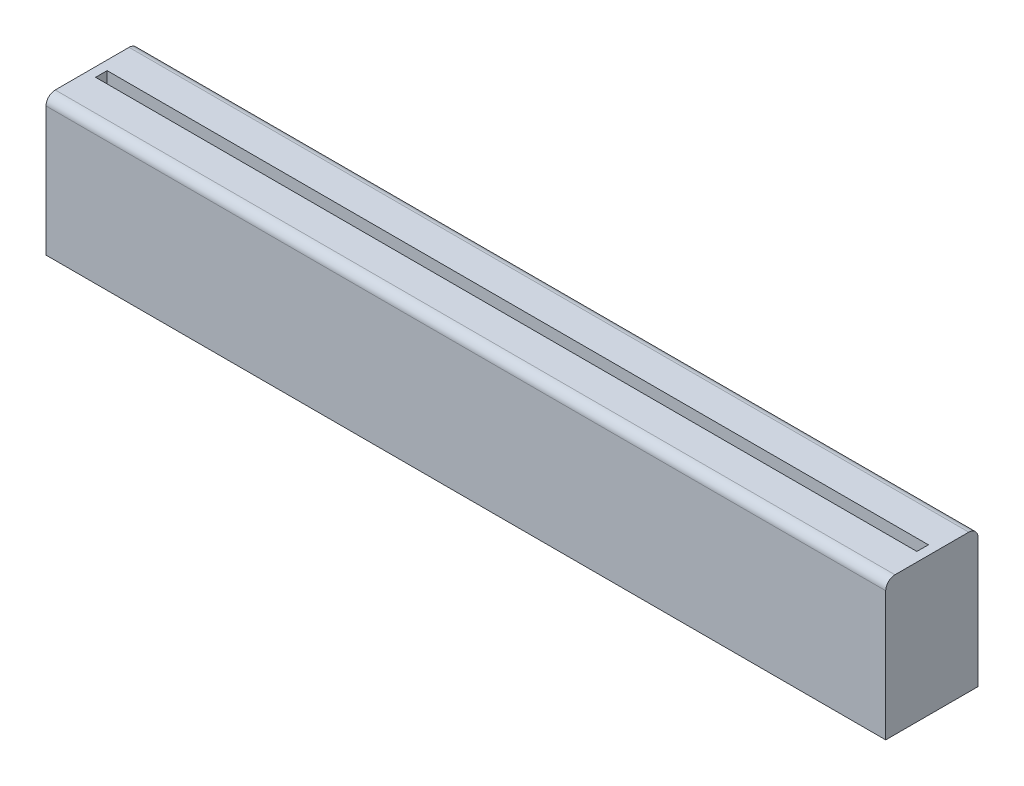
ISO-10303-21;
HEADER;
FILE_DESCRIPTION(('STEP AP214'),'2;1');
FILE_NAME('part.step','',(''),(''),'','','');
FILE_SCHEMA(('AUTOMOTIVE_DESIGN { 1 0 10303 214 1 1 1 1 }'));
ENDSEC;
DATA;
#1=APPLICATION_CONTEXT('core data for automotive mechanical design processes');
#2=APPLICATION_PROTOCOL_DEFINITION('international standard','automotive_design',2000,#1);
#3=PRODUCT_CONTEXT('',#1,'mechanical');
#4=PRODUCT('Part','Part','',(#3));
#5=PRODUCT_RELATED_PRODUCT_CATEGORY('part','',(#4));
#6=PRODUCT_DEFINITION_FORMATION('','',#4);
#7=PRODUCT_DEFINITION_CONTEXT('part definition',#1,'design');
#8=PRODUCT_DEFINITION('design','',#6,#7);
#9=PRODUCT_DEFINITION_SHAPE('','',#8);
#10=(LENGTH_UNIT() NAMED_UNIT(*) SI_UNIT(.MILLI.,.METRE.));
#11=(NAMED_UNIT(*) PLANE_ANGLE_UNIT() SI_UNIT($,.RADIAN.));
#12=(NAMED_UNIT(*) SI_UNIT($,.STERADIAN.) SOLID_ANGLE_UNIT());
#13=UNCERTAINTY_MEASURE_WITH_UNIT(LENGTH_MEASURE(1.E-05),#10,'distance_accuracy_value','');
#14=(GEOMETRIC_REPRESENTATION_CONTEXT(3) GLOBAL_UNCERTAINTY_ASSIGNED_CONTEXT((#13)) GLOBAL_UNIT_ASSIGNED_CONTEXT((#10,
#11,#12)) REPRESENTATION_CONTEXT('',''));
#15=CARTESIAN_POINT('',(0.,0.,0.));
#16=DIRECTION('',(0.,0.,1.));
#17=DIRECTION('',(1.,0.,0.));
#18=AXIS2_PLACEMENT_3D('',#15,#16,#17);
#19=CARTESIAN_POINT('',(114.3,0.,-1.5875));
#20=DIRECTION('',(0.,0.,-1.));
#21=DIRECTION('',(0.,1.,0.));
#22=AXIS2_PLACEMENT_3D('',#19,#20,#21);
#23=PLANE('',#22);
#24=DIRECTION('',(0.,1.,0.));
#25=VECTOR('',#24,1.);
#26=CARTESIAN_POINT('',(-113.03,0.,-1.5875));
#27=LINE('',#26,#25);
#28=CARTESIAN_POINT('',(-113.03,7.62,-1.5875));
#29=VERTEX_POINT('',#28);
#30=CARTESIAN_POINT('',(-113.03,38.1,-1.5875));
#31=VERTEX_POINT('',#30);
#32=EDGE_CURVE('E311',#29,#31,#27,.T.);
#33=ORIENTED_EDGE('',*,*,#32,.F.);
#34=DIRECTION('',(-1.,0.,0.));
#35=VECTOR('',#34,1.);
#36=CARTESIAN_POINT('',(114.3,7.62,-1.5875));
#37=LINE('',#36,#35);
#38=CARTESIAN_POINT('',(113.03,7.62,-1.5875));
#39=VERTEX_POINT('',#38);
#40=EDGE_CURVE('E434',#39,#29,#37,.T.);
#41=ORIENTED_EDGE('',*,*,#40,.F.);
#42=DIRECTION('',(0.,-1.,0.));
#43=VECTOR('',#42,1.);
#44=CARTESIAN_POINT('',(113.03,0.,-1.5875));
#45=LINE('',#44,#43);
#46=CARTESIAN_POINT('',(113.03,38.1,-1.5875));
#47=VERTEX_POINT('',#46);
#48=EDGE_CURVE('E380',#47,#39,#45,.T.);
#49=ORIENTED_EDGE('',*,*,#48,.F.);
#50=DIRECTION('',(-1.,0.,0.));
#51=VECTOR('',#50,1.);
#52=CARTESIAN_POINT('',(114.3,38.1,-1.5875));
#53=LINE('',#52,#51);
#54=EDGE_CURVE('E437',#47,#31,#53,.T.);
#55=ORIENTED_EDGE('',*,*,#54,.T.);
#56=EDGE_LOOP('',(#33,#41,#49,#55));
#57=FACE_BOUND('',#56,.T.);
#58=ADVANCED_FACE('F46',(#57),#23,.F.);
#59=CARTESIAN_POINT('',(114.3,0.,1.5875));
#60=DIRECTION('',(0.,0.,-1.));
#61=DIRECTION('',(0.,1.,0.));
#62=AXIS2_PLACEMENT_3D('',#59,#60,#61);
#63=PLANE('',#62);
#64=DIRECTION('',(-1.,0.,0.));
#65=VECTOR('',#64,1.);
#66=CARTESIAN_POINT('',(114.3,7.62,1.5875));
#67=LINE('',#66,#65);
#68=CARTESIAN_POINT('',(113.03,7.62,1.5875));
#69=VERTEX_POINT('',#68);
#70=CARTESIAN_POINT('',(-113.03,7.62,1.5875));
#71=VERTEX_POINT('',#70);
#72=EDGE_CURVE('E427',#69,#71,#67,.T.);
#73=ORIENTED_EDGE('',*,*,#72,.T.);
#74=DIRECTION('',(0.,1.,0.));
#75=VECTOR('',#74,1.);
#76=CARTESIAN_POINT('',(-113.03,0.,1.5875));
#77=LINE('',#76,#75);
#78=CARTESIAN_POINT('',(-113.03,38.1,1.5875));
#79=VERTEX_POINT('',#78);
#80=EDGE_CURVE('E308',#71,#79,#77,.T.);
#81=ORIENTED_EDGE('',*,*,#80,.T.);
#82=DIRECTION('',(-1.,0.,0.));
#83=VECTOR('',#82,1.);
#84=CARTESIAN_POINT('',(114.3,38.1,1.5875));
#85=LINE('',#84,#83);
#86=CARTESIAN_POINT('',(113.03,38.1,1.5875));
#87=VERTEX_POINT('',#86);
#88=EDGE_CURVE('E424',#87,#79,#85,.T.);
#89=ORIENTED_EDGE('',*,*,#88,.F.);
#90=DIRECTION('',(0.,-1.,0.));
#91=VECTOR('',#90,1.);
#92=CARTESIAN_POINT('',(113.03,0.,1.5875));
#93=LINE('',#92,#91);
#94=EDGE_CURVE('E366',#87,#69,#93,.T.);
#95=ORIENTED_EDGE('',*,*,#94,.T.);
#96=EDGE_LOOP('',(#73,#81,#89,#95));
#97=FACE_BOUND('',#96,.T.);
#98=ADVANCED_FACE('F474',(#97),#63,.T.);
#99=CARTESIAN_POINT('',(114.3,0.,-6.35));
#100=DIRECTION('',(0.,0.,-1.));
#101=DIRECTION('',(0.,1.,0.));
#102=AXIS2_PLACEMENT_3D('',#99,#100,#101);
#103=PLANE('',#102);
#104=DIRECTION('',(0.,-1.,0.));
#105=VECTOR('',#104,1.);
#106=CARTESIAN_POINT('',(-115.57,7.62,-6.35));
#107=LINE('',#106,#105);
#108=CARTESIAN_POINT('',(-115.57,7.62,-6.35));
#109=VERTEX_POINT('',#108);
#110=CARTESIAN_POINT('',(-115.57,2.54,-6.35));
#111=VERTEX_POINT('',#110);
#112=EDGE_CURVE('E238',#109,#111,#107,.T.);
#113=ORIENTED_EDGE('',*,*,#112,.T.);
#114=DIRECTION('',(-1.,0.,0.));
#115=VECTOR('',#114,1.);
#116=CARTESIAN_POINT('',(114.3,2.54,-6.35));
#117=LINE('',#116,#115);
#118=CARTESIAN_POINT('',(113.03,2.54,-6.35));
#119=VERTEX_POINT('',#118);
#120=EDGE_CURVE('E224',#119,#111,#117,.T.);
#121=ORIENTED_EDGE('',*,*,#120,.F.);
#122=DIRECTION('',(0.,-1.,0.));
#123=VECTOR('',#122,1.);
#124=CARTESIAN_POINT('',(113.03,0.,-6.35));
#125=LINE('',#124,#123);
#126=CARTESIAN_POINT('',(113.03,7.62,-6.35));
#127=VERTEX_POINT('',#126);
#128=EDGE_CURVE('E376',#127,#119,#125,.T.);
#129=ORIENTED_EDGE('',*,*,#128,.F.);
#130=DIRECTION('',(-1.,0.,0.));
#131=VECTOR('',#130,1.);
#132=CARTESIAN_POINT('',(114.3,7.62,-6.35));
#133=LINE('',#132,#131);
#134=EDGE_CURVE('E234',#127,#109,#133,.T.);
#135=ORIENTED_EDGE('',*,*,#134,.T.);
#136=EDGE_LOOP('',(#113,#121,#129,#135));
#137=FACE_BOUND('',#136,.T.);
#138=ADVANCED_FACE('F239',(#137),#103,.F.);
#139=CARTESIAN_POINT('',(114.3,2.54,0.));
#140=DIRECTION('',(0.,1.,0.));
#141=DIRECTION('',(0.,0.,1.));
#142=AXIS2_PLACEMENT_3D('',#139,#140,#141);
#143=PLANE('',#142);
#144=DIRECTION('',(0.,0.,1.));
#145=VECTOR('',#144,1.);
#146=CARTESIAN_POINT('',(-115.57,2.54,-6.35));
#147=LINE('',#146,#145);
#148=CARTESIAN_POINT('',(-115.57,2.54,6.35));
#149=VERTEX_POINT('',#148);
#150=EDGE_CURVE('E229',#111,#149,#147,.T.);
#151=ORIENTED_EDGE('',*,*,#150,.T.);
#152=DIRECTION('',(-1.,0.,0.));
#153=VECTOR('',#152,1.);
#154=CARTESIAN_POINT('',(114.3,2.54,6.35));
#155=LINE('',#154,#153);
#156=CARTESIAN_POINT('',(113.03,2.54,6.35));
#157=VERTEX_POINT('',#156);
#158=EDGE_CURVE('E235',#157,#149,#155,.T.);
#159=ORIENTED_EDGE('',*,*,#158,.F.);
#160=DIRECTION('',(0.,0.,-1.));
#161=VECTOR('',#160,1.);
#162=CARTESIAN_POINT('',(113.03,2.54,0.));
#163=LINE('',#162,#161);
#164=EDGE_CURVE('E231',#157,#119,#163,.T.);
#165=ORIENTED_EDGE('',*,*,#164,.T.);
#166=ORIENTED_EDGE('',*,*,#120,.T.);
#167=EDGE_LOOP('',(#151,#159,#165,#166));
#168=FACE_BOUND('',#167,.T.);
#169=ADVANCED_FACE('F226',(#168),#143,.T.);
#170=CARTESIAN_POINT('',(114.3,0.,6.35));
#171=DIRECTION('',(0.,0.,-1.));
#172=DIRECTION('',(-1.,0.,0.));
#173=AXIS2_PLACEMENT_3D('',#170,#171,#172);
#174=PLANE('',#173);
#175=DIRECTION('',(0.,1.,0.));
#176=VECTOR('',#175,1.);
#177=CARTESIAN_POINT('',(-115.57,7.62,6.35));
#178=LINE('',#177,#176);
#179=CARTESIAN_POINT('',(-115.57,7.62,6.35));
#180=VERTEX_POINT('',#179);
#181=EDGE_CURVE('E248',#149,#180,#178,.T.);
#182=ORIENTED_EDGE('',*,*,#181,.T.);
#183=DIRECTION('',(-1.,0.,0.));
#184=VECTOR('',#183,1.);
#185=CARTESIAN_POINT('',(114.3,7.62,6.35));
#186=LINE('',#185,#184);
#187=CARTESIAN_POINT('',(113.03,7.62,6.35));
#188=VERTEX_POINT('',#187);
#189=EDGE_CURVE('E430',#188,#180,#186,.T.);
#190=ORIENTED_EDGE('',*,*,#189,.F.);
#191=DIRECTION('',(0.,-1.,0.));
#192=VECTOR('',#191,1.);
#193=CARTESIAN_POINT('',(113.03,0.,6.35));
#194=LINE('',#193,#192);
#195=EDGE_CURVE('E372',#188,#157,#194,.T.);
#196=ORIENTED_EDGE('',*,*,#195,.T.);
#197=ORIENTED_EDGE('',*,*,#158,.T.);
#198=EDGE_LOOP('',(#182,#190,#196,#197));
#199=FACE_BOUND('',#198,.T.);
#200=ADVANCED_FACE('F488',(#199),#174,.T.);
#201=CARTESIAN_POINT('',(114.3,7.62,0.));
#202=DIRECTION('',(0.,-1.,0.));
#203=DIRECTION('',(0.,0.,-1.));
#204=AXIS2_PLACEMENT_3D('',#201,#202,#203);
#205=PLANE('',#204);
#206=DIRECTION('',(0.,0.,-1.));
#207=VECTOR('',#206,1.);
#208=CARTESIAN_POINT('',(-113.03,7.62,-6.35));
#209=LINE('',#208,#207);
#210=EDGE_CURVE('E244',#71,#29,#209,.T.);
#211=ORIENTED_EDGE('',*,*,#210,.F.);
#212=ORIENTED_EDGE('',*,*,#72,.F.);
#213=DIRECTION('',(0.,0.,1.));
#214=VECTOR('',#213,1.);
#215=CARTESIAN_POINT('',(113.03,7.62,0.));
#216=LINE('',#215,#214);
#217=EDGE_CURVE('E369',#69,#188,#216,.T.);
#218=ORIENTED_EDGE('',*,*,#217,.T.);
#219=ORIENTED_EDGE('',*,*,#189,.T.);
#220=DIRECTION('',(0.,0.,-1.));
#221=VECTOR('',#220,1.);
#222=CARTESIAN_POINT('',(-115.57,7.62,-6.35));
#223=LINE('',#222,#221);
#224=EDGE_CURVE('E250',#180,#109,#223,.T.);
#225=ORIENTED_EDGE('',*,*,#224,.T.);
#226=ORIENTED_EDGE('',*,*,#134,.F.);
#227=DIRECTION('',(0.,0.,-1.));
#228=VECTOR('',#227,1.);
#229=CARTESIAN_POINT('',(113.03,7.62,0.));
#230=LINE('',#229,#228);
#231=EDGE_CURVE('E378',#39,#127,#230,.T.);
#232=ORIENTED_EDGE('',*,*,#231,.F.);
#233=ORIENTED_EDGE('',*,*,#40,.T.);
#234=EDGE_LOOP('',(#211,#212,#218,#219,#225,#226,#232,#233));
#235=FACE_BOUND('',#234,.T.);
#236=ADVANCED_FACE('F491',(#235),#205,.T.);
#237=CARTESIAN_POINT('',(114.3,35.56,-10.16));
#238=DIRECTION('',(-1.,0.,0.));
#239=DIRECTION('',(0.,0.,1.));
#240=AXIS2_PLACEMENT_3D('',#237,#238,#239);
#241=CYLINDRICAL_SURFACE('',#240,2.54);
#242=CARTESIAN_POINT('',(-115.57,35.56,-10.16));
#243=DIRECTION('',(-1.,0.,0.));
#244=DIRECTION('',(0.,0.,1.));
#245=AXIS2_PLACEMENT_3D('',#242,#243,#244);
#246=CIRCLE('',#245,2.54);
#247=CARTESIAN_POINT('',(-115.57,38.1,-10.16));
#248=VERTEX_POINT('',#247);
#249=CARTESIAN_POINT('',(-115.57,35.56,-12.7));
#250=VERTEX_POINT('',#249);
#251=EDGE_CURVE('E271',#248,#250,#246,.T.);
#252=ORIENTED_EDGE('',*,*,#251,.F.);
#253=DIRECTION('',(-1.,0.,0.));
#254=VECTOR('',#253,1.);
#255=CARTESIAN_POINT('',(114.3,38.1,-10.16));
#256=LINE('',#255,#254);
#257=CARTESIAN_POINT('',(115.57,38.1,-10.16));
#258=VERTEX_POINT('',#257);
#259=EDGE_CURVE('E401',#258,#248,#256,.T.);
#260=ORIENTED_EDGE('',*,*,#259,.F.);
#261=CARTESIAN_POINT('',(115.57,35.56,-10.16));
#262=DIRECTION('',(1.,0.,0.));
#263=DIRECTION('',(0.,0.,-1.));
#264=AXIS2_PLACEMENT_3D('',#261,#262,#263);
#265=CIRCLE('',#264,2.54);
#266=CARTESIAN_POINT('',(115.57,35.56,-12.7));
#267=VERTEX_POINT('',#266);
#268=EDGE_CURVE('E326',#267,#258,#265,.T.);
#269=ORIENTED_EDGE('',*,*,#268,.F.);
#270=DIRECTION('',(-1.,0.,0.));
#271=VECTOR('',#270,1.);
#272=CARTESIAN_POINT('',(114.3,35.56,-12.7));
#273=LINE('',#272,#271);
#274=EDGE_CURVE('E382',#267,#250,#273,.T.);
#275=ORIENTED_EDGE('',*,*,#274,.T.);
#276=EDGE_LOOP('',(#252,#260,#269,#275));
#277=FACE_BOUND('',#276,.T.);
#278=ADVANCED_FACE('F48',(#277),#241,.T.);
#279=CARTESIAN_POINT('',(114.3,38.1,0.));
#280=DIRECTION('',(0.,1.,0.));
#281=DIRECTION('',(0.,0.,1.));
#282=AXIS2_PLACEMENT_3D('',#279,#280,#281);
#283=PLANE('',#282);
#284=DIRECTION('',(0.,0.,-1.));
#285=VECTOR('',#284,1.);
#286=CARTESIAN_POINT('',(-113.03,38.1,10.16));
#287=LINE('',#286,#285);
#288=EDGE_CURVE('E254',#79,#31,#287,.T.);
#289=ORIENTED_EDGE('',*,*,#288,.T.);
#290=ORIENTED_EDGE('',*,*,#54,.F.);
#291=DIRECTION('',(0.,0.,-1.));
#292=VECTOR('',#291,1.);
#293=CARTESIAN_POINT('',(113.03,38.1,0.));
#294=LINE('',#293,#292);
#295=EDGE_CURVE('E313',#87,#47,#294,.T.);
#296=ORIENTED_EDGE('',*,*,#295,.F.);
#297=ORIENTED_EDGE('',*,*,#88,.T.);
#298=EDGE_LOOP('',(#289,#290,#296,#297));
#299=FACE_BOUND('',#298,.T.);
#300=DIRECTION('',(0.,0.,-1.));
#301=VECTOR('',#300,1.);
#302=CARTESIAN_POINT('',(-115.57,38.1,10.16));
#303=LINE('',#302,#301);
#304=CARTESIAN_POINT('',(-115.57,38.1,10.16));
#305=VERTEX_POINT('',#304);
#306=EDGE_CURVE('E268',#305,#248,#303,.T.);
#307=ORIENTED_EDGE('',*,*,#306,.F.);
#308=DIRECTION('',(-1.,0.,0.));
#309=VECTOR('',#308,1.);
#310=CARTESIAN_POINT('',(114.3,38.1,10.16));
#311=LINE('',#310,#309);
#312=CARTESIAN_POINT('',(115.57,38.1,10.16));
#313=VERTEX_POINT('',#312);
#314=EDGE_CURVE('E422',#313,#305,#311,.T.);
#315=ORIENTED_EDGE('',*,*,#314,.F.);
#316=DIRECTION('',(0.,0.,-1.));
#317=VECTOR('',#316,1.);
#318=CARTESIAN_POINT('',(115.57,38.1,0.));
#319=LINE('',#318,#317);
#320=EDGE_CURVE('E329',#313,#258,#319,.T.);
#321=ORIENTED_EDGE('',*,*,#320,.T.);
#322=ORIENTED_EDGE('',*,*,#259,.T.);
#323=EDGE_LOOP('',(#307,#315,#321,#322));
#324=FACE_BOUND('',#323,.T.);
#325=ADVANCED_FACE('F441',(#299,#324),#283,.T.);
#326=CARTESIAN_POINT('',(114.3,35.56,10.16));
#327=DIRECTION('',(-1.,0.,0.));
#328=DIRECTION('',(0.,0.,1.));
#329=AXIS2_PLACEMENT_3D('',#326,#327,#328);
#330=CYLINDRICAL_SURFACE('',#329,2.54);
#331=CARTESIAN_POINT('',(-115.57,35.56,10.16));
#332=DIRECTION('',(-1.,0.,0.));
#333=DIRECTION('',(0.,0.,1.));
#334=AXIS2_PLACEMENT_3D('',#331,#332,#333);
#335=CIRCLE('',#334,2.54);
#336=CARTESIAN_POINT('',(-115.57,35.56,12.7));
#337=VERTEX_POINT('',#336);
#338=EDGE_CURVE('E265',#337,#305,#335,.T.);
#339=ORIENTED_EDGE('',*,*,#338,.F.);
#340=DIRECTION('',(-1.,0.,0.));
#341=VECTOR('',#340,1.);
#342=CARTESIAN_POINT('',(114.3,35.56,12.7));
#343=LINE('',#342,#341);
#344=CARTESIAN_POINT('',(115.57,35.56,12.7));
#345=VERTEX_POINT('',#344);
#346=EDGE_CURVE('E420',#345,#337,#343,.T.);
#347=ORIENTED_EDGE('',*,*,#346,.F.);
#348=CARTESIAN_POINT('',(115.57,35.56,10.16));
#349=DIRECTION('',(1.,0.,0.));
#350=DIRECTION('',(0.,0.,-1.));
#351=AXIS2_PLACEMENT_3D('',#348,#349,#350);
#352=CIRCLE('',#351,2.54);
#353=EDGE_CURVE('E314',#313,#345,#352,.T.);
#354=ORIENTED_EDGE('',*,*,#353,.F.);
#355=ORIENTED_EDGE('',*,*,#314,.T.);
#356=EDGE_LOOP('',(#339,#347,#354,#355));
#357=FACE_BOUND('',#356,.T.);
#358=ADVANCED_FACE('F460',(#357),#330,.T.);
#359=CARTESIAN_POINT('',(114.3,0.,12.7));
#360=DIRECTION('',(0.,0.,1.));
#361=DIRECTION('',(1.,0.,0.));
#362=AXIS2_PLACEMENT_3D('',#359,#360,#361);
#363=PLANE('',#362);
#364=DIRECTION('',(0.,1.,0.));
#365=VECTOR('',#364,1.);
#366=CARTESIAN_POINT('',(-115.57,0.,12.7));
#367=LINE('',#366,#365);
#368=CARTESIAN_POINT('',(-115.57,0.,12.7));
#369=VERTEX_POINT('',#368);
#370=EDGE_CURVE('E262',#369,#337,#367,.T.);
#371=ORIENTED_EDGE('',*,*,#370,.F.);
#372=DIRECTION('',(-1.,0.,0.));
#373=VECTOR('',#372,1.);
#374=CARTESIAN_POINT('',(114.3,0.,12.7));
#375=LINE('',#374,#373);
#376=CARTESIAN_POINT('',(115.57,0.,12.7));
#377=VERTEX_POINT('',#376);
#378=EDGE_CURVE('E418',#377,#369,#375,.T.);
#379=ORIENTED_EDGE('',*,*,#378,.F.);
#380=DIRECTION('',(0.,1.,0.));
#381=VECTOR('',#380,1.);
#382=CARTESIAN_POINT('',(115.57,0.,12.7));
#383=LINE('',#382,#381);
#384=EDGE_CURVE('E317',#377,#345,#383,.T.);
#385=ORIENTED_EDGE('',*,*,#384,.T.);
#386=ORIENTED_EDGE('',*,*,#346,.T.);
#387=EDGE_LOOP('',(#371,#379,#385,#386));
#388=FACE_BOUND('',#387,.T.);
#389=ADVANCED_FACE('F456',(#388),#363,.T.);
#390=CARTESIAN_POINT('',(114.3,0.,0.));
#391=DIRECTION('',(0.,-1.,0.));
#392=DIRECTION('',(0.,0.,-1.));
#393=AXIS2_PLACEMENT_3D('',#390,#391,#392);
#394=PLANE('',#393);
#395=DIRECTION('',(0.,0.,1.));
#396=VECTOR('',#395,1.);
#397=CARTESIAN_POINT('',(-115.57,0.,-12.7));
#398=LINE('',#397,#396);
#399=CARTESIAN_POINT('',(-115.57,0.,-12.7));
#400=VERTEX_POINT('',#399);
#401=EDGE_CURVE('E259',#400,#369,#398,.T.);
#402=ORIENTED_EDGE('',*,*,#401,.F.);
#403=DIRECTION('',(-1.,0.,0.));
#404=VECTOR('',#403,1.);
#405=CARTESIAN_POINT('',(114.3,0.,-12.7));
#406=LINE('',#405,#404);
#407=CARTESIAN_POINT('',(115.57,0.,-12.7));
#408=VERTEX_POINT('',#407);
#409=EDGE_CURVE('E416',#408,#400,#406,.T.);
#410=ORIENTED_EDGE('',*,*,#409,.F.);
#411=DIRECTION('',(0.,0.,1.));
#412=VECTOR('',#411,1.);
#413=CARTESIAN_POINT('',(115.57,0.,0.));
#414=LINE('',#413,#412);
#415=EDGE_CURVE('E320',#408,#377,#414,.T.);
#416=ORIENTED_EDGE('',*,*,#415,.T.);
#417=ORIENTED_EDGE('',*,*,#378,.T.);
#418=EDGE_LOOP('',(#402,#410,#416,#417));
#419=FACE_BOUND('',#418,.T.);
#420=ADVANCED_FACE('F464',(#419),#394,.T.);
#421=CARTESIAN_POINT('',(114.3,0.,-12.7));
#422=DIRECTION('',(0.,0.,1.));
#423=DIRECTION('',(0.,-1.,0.));
#424=AXIS2_PLACEMENT_3D('',#421,#422,#423);
#425=PLANE('',#424);
#426=DIRECTION('',(0.,-1.,0.));
#427=VECTOR('',#426,1.);
#428=CARTESIAN_POINT('',(-115.57,35.56,-12.7));
#429=LINE('',#428,#427);
#430=EDGE_CURVE('E256',#250,#400,#429,.T.);
#431=ORIENTED_EDGE('',*,*,#430,.F.);
#432=ORIENTED_EDGE('',*,*,#274,.F.);
#433=DIRECTION('',(0.,-1.,0.));
#434=VECTOR('',#433,1.);
#435=CARTESIAN_POINT('',(115.57,0.,-12.7));
#436=LINE('',#435,#434);
#437=EDGE_CURVE('E323',#267,#408,#436,.T.);
#438=ORIENTED_EDGE('',*,*,#437,.T.);
#439=ORIENTED_EDGE('',*,*,#409,.T.);
#440=EDGE_LOOP('',(#431,#432,#438,#439));
#441=FACE_BOUND('',#440,.T.);
#442=ADVANCED_FACE('F451',(#441),#425,.F.);
#443=CARTESIAN_POINT('',(115.57,35.56,10.16));
#444=DIRECTION('',(1.,0.,0.));
#445=DIRECTION('',(0.,0.,-1.));
#446=AXIS2_PLACEMENT_3D('',#443,#444,#445);
#447=PLANE('',#446);
#448=ORIENTED_EDGE('',*,*,#353,.T.);
#449=ORIENTED_EDGE('',*,*,#384,.F.);
#450=ORIENTED_EDGE('',*,*,#415,.F.);
#451=ORIENTED_EDGE('',*,*,#437,.F.);
#452=ORIENTED_EDGE('',*,*,#268,.T.);
#453=ORIENTED_EDGE('',*,*,#320,.F.);
#454=EDGE_LOOP('',(#448,#449,#450,#451,#452,#453));
#455=FACE_BOUND('',#454,.T.);
#456=ADVANCED_FACE('F462',(#455),#447,.T.);
#457=CARTESIAN_POINT('',(113.03,35.56,10.16));
#458=DIRECTION('',(1.,0.,0.));
#459=DIRECTION('',(0.,0.,-1.));
#460=AXIS2_PLACEMENT_3D('',#457,#458,#459);
#461=PLANE('',#460);
#462=ORIENTED_EDGE('',*,*,#295,.T.);
#463=ORIENTED_EDGE('',*,*,#48,.T.);
#464=ORIENTED_EDGE('',*,*,#231,.T.);
#465=ORIENTED_EDGE('',*,*,#128,.T.);
#466=ORIENTED_EDGE('',*,*,#164,.F.);
#467=ORIENTED_EDGE('',*,*,#195,.F.);
#468=ORIENTED_EDGE('',*,*,#217,.F.);
#469=ORIENTED_EDGE('',*,*,#94,.F.);
#470=EDGE_LOOP('',(#462,#463,#464,#465,#466,#467,#468,#469));
#471=FACE_BOUND('',#470,.T.);
#472=ADVANCED_FACE('F533',(#471),#461,.F.);
#473=CARTESIAN_POINT('',(-115.57,35.56,10.16));
#474=DIRECTION('',(-1.,0.,0.));
#475=DIRECTION('',(0.,0.,1.));
#476=AXIS2_PLACEMENT_3D('',#473,#474,#475);
#477=PLANE('',#476);
#478=ORIENTED_EDGE('',*,*,#430,.T.);
#479=ORIENTED_EDGE('',*,*,#401,.T.);
#480=ORIENTED_EDGE('',*,*,#370,.T.);
#481=ORIENTED_EDGE('',*,*,#338,.T.);
#482=ORIENTED_EDGE('',*,*,#306,.T.);
#483=ORIENTED_EDGE('',*,*,#251,.T.);
#484=EDGE_LOOP('',(#478,#479,#480,#481,#482,#483));
#485=FACE_BOUND('',#484,.T.);
#486=ORIENTED_EDGE('',*,*,#150,.F.);
#487=ORIENTED_EDGE('',*,*,#112,.F.);
#488=ORIENTED_EDGE('',*,*,#224,.F.);
#489=ORIENTED_EDGE('',*,*,#181,.F.);
#490=EDGE_LOOP('',(#486,#487,#488,#489));
#491=FACE_BOUND('',#490,.T.);
#492=ADVANCED_FACE('F246',(#485,#491),#477,.T.);
#493=CARTESIAN_POINT('',(-113.03,35.56,10.16));
#494=DIRECTION('',(-1.,0.,0.));
#495=DIRECTION('',(0.,0.,1.));
#496=AXIS2_PLACEMENT_3D('',#493,#494,#495);
#497=PLANE('',#496);
#498=ORIENTED_EDGE('',*,*,#210,.T.);
#499=ORIENTED_EDGE('',*,*,#32,.T.);
#500=ORIENTED_EDGE('',*,*,#288,.F.);
#501=ORIENTED_EDGE('',*,*,#80,.F.);
#502=EDGE_LOOP('',(#498,#499,#500,#501));
#503=FACE_BOUND('',#502,.T.);
#504=ADVANCED_FACE('F532',(#503),#497,.F.);
#505=CLOSED_SHELL('',(#58,#98,#138,#169,#200,#236,#278,#325,#358,#389,#420,#442,#456,#472,#492,#504));
#506=DIRECTION('',(0.,0.,-1.));
#507=VECTOR('',#506,1.);
#508=CARTESIAN_POINT('',(113.03,2.54,0.));
#509=LINE('',#508,#507);
#510=CARTESIAN_POINT('',(113.03,2.54,-8.89));
#511=VERTEX_POINT('',#510);
#512=CARTESIAN_POINT('',(113.03,2.54,-10.16));
#513=VERTEX_POINT('',#512);
#514=EDGE_CURVE('E363',#511,#513,#509,.T.);
#515=ORIENTED_EDGE('',*,*,#514,.F.);
#516=DIRECTION('',(0.,-1.,0.));
#517=VECTOR('',#516,1.);
#518=CARTESIAN_POINT('',(113.03,0.,-8.89));
#519=LINE('',#518,#517);
#520=CARTESIAN_POINT('',(113.03,10.16,-8.89));
#521=VERTEX_POINT('',#520);
#522=EDGE_CURVE('E360',#521,#511,#519,.T.);
#523=ORIENTED_EDGE('',*,*,#522,.F.);
#524=DIRECTION('',(0.,0.,-1.));
#525=VECTOR('',#524,1.);
#526=CARTESIAN_POINT('',(113.03,10.16,0.));
#527=LINE('',#526,#525);
#528=CARTESIAN_POINT('',(113.03,10.16,-4.1275));
#529=VERTEX_POINT('',#528);
#530=EDGE_CURVE('E357',#529,#521,#527,.T.);
#531=ORIENTED_EDGE('',*,*,#530,.F.);
#532=DIRECTION('',(0.,-1.,0.));
#533=VECTOR('',#532,1.);
#534=CARTESIAN_POINT('',(113.03,0.,-4.1275));
#535=LINE('',#534,#533);
#536=CARTESIAN_POINT('',(113.03,35.56,-4.1275));
#537=VERTEX_POINT('',#536);
#538=EDGE_CURVE('E354',#537,#529,#535,.T.);
#539=ORIENTED_EDGE('',*,*,#538,.F.);
#540=DIRECTION('',(0.,0.,1.));
#541=VECTOR('',#540,1.);
#542=CARTESIAN_POINT('',(113.03,35.56,0.));
#543=LINE('',#542,#541);
#544=CARTESIAN_POINT('',(113.03,35.56,-10.16));
#545=VERTEX_POINT('',#544);
#546=EDGE_CURVE('E351',#545,#537,#543,.T.);
#547=ORIENTED_EDGE('',*,*,#546,.F.);
#548=DIRECTION('',(0.,1.,0.));
#549=VECTOR('',#548,1.);
#550=CARTESIAN_POINT('',(113.03,0.,-10.16));
#551=LINE('',#550,#549);
#552=EDGE_CURVE('E348',#513,#545,#551,.T.);
#553=ORIENTED_EDGE('',*,*,#552,.F.);
#554=EDGE_LOOP('',(#515,#523,#531,#539,#547,#553));
#555=FACE_BOUND('',#554,.T.);
#556=ADVANCED_FACE('F557',(#555),#461,.F.);
#557=CARTESIAN_POINT('',(114.3,0.,-10.16));
#558=DIRECTION('',(0.,0.,1.));
#559=DIRECTION('',(1.,0.,0.));
#560=AXIS2_PLACEMENT_3D('',#557,#558,#559);
#561=PLANE('',#560);
#562=DIRECTION('',(-1.,0.,0.));
#563=VECTOR('',#562,1.);
#564=CARTESIAN_POINT('',(114.3,35.56,-10.16));
#565=LINE('',#564,#563);
#566=CARTESIAN_POINT('',(-113.03,35.56,-10.16));
#567=VERTEX_POINT('',#566);
#568=EDGE_CURVE('E400',#545,#567,#565,.T.);
#569=ORIENTED_EDGE('',*,*,#568,.T.);
#570=DIRECTION('',(0.,-1.,0.));
#571=VECTOR('',#570,1.);
#572=CARTESIAN_POINT('',(-113.03,0.,-10.16));
#573=LINE('',#572,#571);
#574=CARTESIAN_POINT('',(-113.03,2.54,-10.16));
#575=VERTEX_POINT('',#574);
#576=EDGE_CURVE('E290',#567,#575,#573,.T.);
#577=ORIENTED_EDGE('',*,*,#576,.T.);
#578=DIRECTION('',(-1.,0.,0.));
#579=VECTOR('',#578,1.);
#580=CARTESIAN_POINT('',(114.3,2.54,-10.16));
#581=LINE('',#580,#579);
#582=EDGE_CURVE('E397',#513,#575,#581,.T.);
#583=ORIENTED_EDGE('',*,*,#582,.F.);
#584=ORIENTED_EDGE('',*,*,#552,.T.);
#585=EDGE_LOOP('',(#569,#577,#583,#584));
#586=FACE_BOUND('',#585,.T.);
#587=ADVANCED_FACE('F552',(#586),#561,.T.);
#588=CARTESIAN_POINT('',(114.3,35.56,0.));
#589=DIRECTION('',(0.,-1.,0.));
#590=DIRECTION('',(0.,0.,-1.));
#591=AXIS2_PLACEMENT_3D('',#588,#589,#590);
#592=PLANE('',#591);
#593=DIRECTION('',(-1.,0.,0.));
#594=VECTOR('',#593,1.);
#595=CARTESIAN_POINT('',(114.3,35.56,-4.1275));
#596=LINE('',#595,#594);
#597=CARTESIAN_POINT('',(-113.03,35.56,-4.1275));
#598=VERTEX_POINT('',#597);
#599=EDGE_CURVE('E404',#537,#598,#596,.T.);
#600=ORIENTED_EDGE('',*,*,#599,.T.);
#601=DIRECTION('',(0.,0.,-1.));
#602=VECTOR('',#601,1.);
#603=CARTESIAN_POINT('',(-113.03,35.56,0.));
#604=LINE('',#603,#602);
#605=EDGE_CURVE('E293',#598,#567,#604,.T.);
#606=ORIENTED_EDGE('',*,*,#605,.T.);
#607=ORIENTED_EDGE('',*,*,#568,.F.);
#608=ORIENTED_EDGE('',*,*,#546,.T.);
#609=EDGE_LOOP('',(#600,#606,#607,#608));
#610=FACE_BOUND('',#609,.T.);
#611=ADVANCED_FACE('F556',(#610),#592,.T.);
#612=CARTESIAN_POINT('',(114.3,0.,-4.1275));
#613=DIRECTION('',(0.,0.,-1.));
#614=DIRECTION('',(-1.,0.,0.));
#615=AXIS2_PLACEMENT_3D('',#612,#613,#614);
#616=PLANE('',#615);
#617=DIRECTION('',(-1.,0.,0.));
#618=VECTOR('',#617,1.);
#619=CARTESIAN_POINT('',(114.3,10.16,-4.1275));
#620=LINE('',#619,#618);
#621=CARTESIAN_POINT('',(-113.03,10.16,-4.1275));
#622=VERTEX_POINT('',#621);
#623=EDGE_CURVE('E407',#529,#622,#620,.T.);
#624=ORIENTED_EDGE('',*,*,#623,.T.);
#625=DIRECTION('',(0.,1.,0.));
#626=VECTOR('',#625,1.);
#627=CARTESIAN_POINT('',(-113.03,0.,-4.1275));
#628=LINE('',#627,#626);
#629=EDGE_CURVE('E296',#622,#598,#628,.T.);
#630=ORIENTED_EDGE('',*,*,#629,.T.);
#631=ORIENTED_EDGE('',*,*,#599,.F.);
#632=ORIENTED_EDGE('',*,*,#538,.T.);
#633=EDGE_LOOP('',(#624,#630,#631,#632));
#634=FACE_BOUND('',#633,.T.);
#635=ADVANCED_FACE('F568',(#634),#616,.T.);
#636=CARTESIAN_POINT('',(114.3,10.16,0.));
#637=DIRECTION('',(0.,1.,0.));
#638=DIRECTION('',(0.,0.,1.));
#639=AXIS2_PLACEMENT_3D('',#636,#637,#638);
#640=PLANE('',#639);
#641=DIRECTION('',(-1.,0.,0.));
#642=VECTOR('',#641,1.);
#643=CARTESIAN_POINT('',(114.3,10.16,-8.89));
#644=LINE('',#643,#642);
#645=CARTESIAN_POINT('',(-113.03,10.16,-8.89));
#646=VERTEX_POINT('',#645);
#647=EDGE_CURVE('E410',#521,#646,#644,.T.);
#648=ORIENTED_EDGE('',*,*,#647,.T.);
#649=DIRECTION('',(0.,0.,1.));
#650=VECTOR('',#649,1.);
#651=CARTESIAN_POINT('',(-113.03,10.16,0.));
#652=LINE('',#651,#650);
#653=EDGE_CURVE('E299',#646,#622,#652,.T.);
#654=ORIENTED_EDGE('',*,*,#653,.T.);
#655=ORIENTED_EDGE('',*,*,#623,.F.);
#656=ORIENTED_EDGE('',*,*,#530,.T.);
#657=EDGE_LOOP('',(#648,#654,#655,#656));
#658=FACE_BOUND('',#657,.T.);
#659=ADVANCED_FACE('F576',(#658),#640,.T.);
#660=CARTESIAN_POINT('',(114.3,0.,-8.89));
#661=DIRECTION('',(0.,0.,-1.));
#662=DIRECTION('',(-1.,0.,0.));
#663=AXIS2_PLACEMENT_3D('',#660,#661,#662);
#664=PLANE('',#663);
#665=DIRECTION('',(-1.,0.,0.));
#666=VECTOR('',#665,1.);
#667=CARTESIAN_POINT('',(114.3,2.54,-8.89));
#668=LINE('',#667,#666);
#669=CARTESIAN_POINT('',(-113.03,2.54,-8.89));
#670=VERTEX_POINT('',#669);
#671=EDGE_CURVE('E386',#511,#670,#668,.T.);
#672=ORIENTED_EDGE('',*,*,#671,.T.);
#673=DIRECTION('',(0.,1.,0.));
#674=VECTOR('',#673,1.);
#675=CARTESIAN_POINT('',(-113.03,0.,-8.89));
#676=LINE('',#675,#674);
#677=EDGE_CURVE('E302',#670,#646,#676,.T.);
#678=ORIENTED_EDGE('',*,*,#677,.T.);
#679=ORIENTED_EDGE('',*,*,#647,.F.);
#680=ORIENTED_EDGE('',*,*,#522,.T.);
#681=EDGE_LOOP('',(#672,#678,#679,#680));
#682=FACE_BOUND('',#681,.T.);
#683=ADVANCED_FACE('F584',(#682),#664,.T.);
#684=CARTESIAN_POINT('',(114.3,2.54,0.));
#685=DIRECTION('',(0.,1.,0.));
#686=DIRECTION('',(0.,0.,1.));
#687=AXIS2_PLACEMENT_3D('',#684,#685,#686);
#688=PLANE('',#687);
#689=ORIENTED_EDGE('',*,*,#582,.T.);
#690=DIRECTION('',(0.,0.,1.));
#691=VECTOR('',#690,1.);
#692=CARTESIAN_POINT('',(-113.03,2.54,0.));
#693=LINE('',#692,#691);
#694=EDGE_CURVE('E305',#575,#670,#693,.T.);
#695=ORIENTED_EDGE('',*,*,#694,.T.);
#696=ORIENTED_EDGE('',*,*,#671,.F.);
#697=ORIENTED_EDGE('',*,*,#514,.T.);
#698=EDGE_LOOP('',(#689,#695,#696,#697));
#699=FACE_BOUND('',#698,.T.);
#700=ADVANCED_FACE('F592',(#699),#688,.T.);
#701=ORIENTED_EDGE('',*,*,#694,.F.);
#702=ORIENTED_EDGE('',*,*,#576,.F.);
#703=ORIENTED_EDGE('',*,*,#605,.F.);
#704=ORIENTED_EDGE('',*,*,#629,.F.);
#705=ORIENTED_EDGE('',*,*,#653,.F.);
#706=ORIENTED_EDGE('',*,*,#677,.F.);
#707=EDGE_LOOP('',(#701,#702,#703,#704,#705,#706));
#708=FACE_BOUND('',#707,.T.);
#709=ADVANCED_FACE('F546',(#708),#497,.F.);
#710=CLOSED_SHELL('',(#556,#587,#611,#635,#659,#683,#700,#709));
#711=DIRECTION('',(0.,0.,-1.));
#712=VECTOR('',#711,1.);
#713=CARTESIAN_POINT('',(-113.03,2.54,0.));
#714=LINE('',#713,#712);
#715=CARTESIAN_POINT('',(-113.03,2.54,10.16));
#716=VERTEX_POINT('',#715);
#717=CARTESIAN_POINT('',(-113.03,2.54,8.89));
#718=VERTEX_POINT('',#717);
#719=EDGE_CURVE('E69',#716,#718,#714,.T.);
#720=ORIENTED_EDGE('',*,*,#719,.T.);
#721=DIRECTION('',(0.,1.,0.));
#722=VECTOR('',#721,1.);
#723=CARTESIAN_POINT('',(-113.03,0.,8.89));
#724=LINE('',#723,#722);
#725=CARTESIAN_POINT('',(-113.03,10.16,8.89));
#726=VERTEX_POINT('',#725);
#727=EDGE_CURVE('E62',#718,#726,#724,.T.);
#728=ORIENTED_EDGE('',*,*,#727,.T.);
#729=DIRECTION('',(0.,0.,-1.));
#730=VECTOR('',#729,1.);
#731=CARTESIAN_POINT('',(-113.03,10.16,0.));
#732=LINE('',#731,#730);
#733=CARTESIAN_POINT('',(-113.03,10.16,4.1275));
#734=VERTEX_POINT('',#733);
#735=EDGE_CURVE('E274',#726,#734,#732,.T.);
#736=ORIENTED_EDGE('',*,*,#735,.T.);
#737=DIRECTION('',(0.,1.,0.));
#738=VECTOR('',#737,1.);
#739=CARTESIAN_POINT('',(-113.03,0.,4.1275));
#740=LINE('',#739,#738);
#741=CARTESIAN_POINT('',(-113.03,35.56,4.1275));
#742=VERTEX_POINT('',#741);
#743=EDGE_CURVE('E279',#734,#742,#740,.T.);
#744=ORIENTED_EDGE('',*,*,#743,.T.);
#745=DIRECTION('',(0.,0.,1.));
#746=VECTOR('',#745,1.);
#747=CARTESIAN_POINT('',(-113.03,35.56,0.));
#748=LINE('',#747,#746);
#749=CARTESIAN_POINT('',(-113.03,35.56,10.16));
#750=VERTEX_POINT('',#749);
#751=EDGE_CURVE('E282',#742,#750,#748,.T.);
#752=ORIENTED_EDGE('',*,*,#751,.T.);
#753=DIRECTION('',(0.,-1.,0.));
#754=VECTOR('',#753,1.);
#755=CARTESIAN_POINT('',(-113.03,0.,10.16));
#756=LINE('',#755,#754);
#757=EDGE_CURVE('E285',#750,#716,#756,.T.);
#758=ORIENTED_EDGE('',*,*,#757,.T.);
#759=EDGE_LOOP('',(#720,#728,#736,#744,#752,#758));
#760=FACE_BOUND('',#759,.T.);
#761=ADVANCED_FACE('F545',(#760),#497,.F.);
#762=DIRECTION('',(0.,0.,1.));
#763=VECTOR('',#762,1.);
#764=CARTESIAN_POINT('',(113.03,10.16,0.));
#765=LINE('',#764,#763);
#766=CARTESIAN_POINT('',(113.03,10.16,4.1275));
#767=VERTEX_POINT('',#766);
#768=CARTESIAN_POINT('',(113.03,10.16,8.89));
#769=VERTEX_POINT('',#768);
#770=EDGE_CURVE('E11',#767,#769,#765,.T.);
#771=ORIENTED_EDGE('',*,*,#770,.T.);
#772=DIRECTION('',(0.,-1.,0.));
#773=VECTOR('',#772,1.);
#774=CARTESIAN_POINT('',(113.03,0.,8.89));
#775=LINE('',#774,#773);
#776=CARTESIAN_POINT('',(113.03,2.54,8.89));
#777=VERTEX_POINT('',#776);
#778=EDGE_CURVE('E345',#769,#777,#775,.T.);
#779=ORIENTED_EDGE('',*,*,#778,.T.);
#780=DIRECTION('',(0.,0.,1.));
#781=VECTOR('',#780,1.);
#782=CARTESIAN_POINT('',(113.03,2.54,0.));
#783=LINE('',#782,#781);
#784=CARTESIAN_POINT('',(113.03,2.54,10.16));
#785=VERTEX_POINT('',#784);
#786=EDGE_CURVE('E342',#777,#785,#783,.T.);
#787=ORIENTED_EDGE('',*,*,#786,.T.);
#788=DIRECTION('',(0.,1.,0.));
#789=VECTOR('',#788,1.);
#790=CARTESIAN_POINT('',(113.03,0.,10.16));
#791=LINE('',#790,#789);
#792=CARTESIAN_POINT('',(113.03,35.56,10.16));
#793=VERTEX_POINT('',#792);
#794=EDGE_CURVE('E339',#785,#793,#791,.T.);
#795=ORIENTED_EDGE('',*,*,#794,.T.);
#796=DIRECTION('',(0.,0.,-1.));
#797=VECTOR('',#796,1.);
#798=CARTESIAN_POINT('',(113.03,35.56,0.));
#799=LINE('',#798,#797);
#800=CARTESIAN_POINT('',(113.03,35.56,4.1275));
#801=VERTEX_POINT('',#800);
#802=EDGE_CURVE('E336',#793,#801,#799,.T.);
#803=ORIENTED_EDGE('',*,*,#802,.T.);
#804=DIRECTION('',(0.,-1.,0.));
#805=VECTOR('',#804,1.);
#806=CARTESIAN_POINT('',(113.03,0.,4.1275));
#807=LINE('',#806,#805);
#808=EDGE_CURVE('E332',#801,#767,#807,.T.);
#809=ORIENTED_EDGE('',*,*,#808,.T.);
#810=EDGE_LOOP('',(#771,#779,#787,#795,#803,#809));
#811=FACE_BOUND('',#810,.T.);
#812=ADVANCED_FACE('F616',(#811),#461,.F.);
#813=CARTESIAN_POINT('',(114.3,10.16,0.));
#814=DIRECTION('',(0.,-1.,0.));
#815=DIRECTION('',(0.,0.,-1.));
#816=AXIS2_PLACEMENT_3D('',#813,#814,#815);
#817=PLANE('',#816);
#818=ORIENTED_EDGE('',*,*,#735,.F.);
#819=DIRECTION('',(-1.,0.,0.));
#820=VECTOR('',#819,1.);
#821=CARTESIAN_POINT('',(114.3,10.16,8.89));
#822=LINE('',#821,#820);
#823=EDGE_CURVE('E383',#769,#726,#822,.T.);
#824=ORIENTED_EDGE('',*,*,#823,.F.);
#825=ORIENTED_EDGE('',*,*,#770,.F.);
#826=DIRECTION('',(-1.,0.,0.));
#827=VECTOR('',#826,1.);
#828=CARTESIAN_POINT('',(114.3,10.16,4.1275));
#829=LINE('',#828,#827);
#830=EDGE_CURVE('E385',#767,#734,#829,.T.);
#831=ORIENTED_EDGE('',*,*,#830,.T.);
#832=EDGE_LOOP('',(#818,#824,#825,#831));
#833=FACE_BOUND('',#832,.T.);
#834=ADVANCED_FACE('F624',(#833),#817,.F.);
#835=CARTESIAN_POINT('',(114.3,0.,4.1275));
#836=DIRECTION('',(0.,0.,-1.));
#837=DIRECTION('',(-1.,0.,0.));
#838=AXIS2_PLACEMENT_3D('',#835,#836,#837);
#839=PLANE('',#838);
#840=ORIENTED_EDGE('',*,*,#743,.F.);
#841=ORIENTED_EDGE('',*,*,#830,.F.);
#842=ORIENTED_EDGE('',*,*,#808,.F.);
#843=DIRECTION('',(-1.,0.,0.));
#844=VECTOR('',#843,1.);
#845=CARTESIAN_POINT('',(114.3,35.56,4.1275));
#846=LINE('',#845,#844);
#847=EDGE_CURVE('E388',#801,#742,#846,.T.);
#848=ORIENTED_EDGE('',*,*,#847,.T.);
#849=EDGE_LOOP('',(#840,#841,#842,#848));
#850=FACE_BOUND('',#849,.T.);
#851=ADVANCED_FACE('F627',(#850),#839,.F.);
#852=CARTESIAN_POINT('',(114.3,35.56,0.));
#853=DIRECTION('',(0.,1.,0.));
#854=DIRECTION('',(0.,0.,1.));
#855=AXIS2_PLACEMENT_3D('',#852,#853,#854);
#856=PLANE('',#855);
#857=ORIENTED_EDGE('',*,*,#751,.F.);
#858=ORIENTED_EDGE('',*,*,#847,.F.);
#859=ORIENTED_EDGE('',*,*,#802,.F.);
#860=DIRECTION('',(-1.,0.,0.));
#861=VECTOR('',#860,1.);
#862=CARTESIAN_POINT('',(114.3,35.56,10.16));
#863=LINE('',#862,#861);
#864=EDGE_CURVE('E391',#793,#750,#863,.T.);
#865=ORIENTED_EDGE('',*,*,#864,.T.);
#866=EDGE_LOOP('',(#857,#858,#859,#865));
#867=FACE_BOUND('',#866,.T.);
#868=ADVANCED_FACE('F634',(#867),#856,.F.);
#869=CARTESIAN_POINT('',(114.3,0.,10.16));
#870=DIRECTION('',(0.,0.,1.));
#871=DIRECTION('',(0.,-1.,0.));
#872=AXIS2_PLACEMENT_3D('',#869,#870,#871);
#873=PLANE('',#872);
#874=ORIENTED_EDGE('',*,*,#757,.F.);
#875=ORIENTED_EDGE('',*,*,#864,.F.);
#876=ORIENTED_EDGE('',*,*,#794,.F.);
#877=DIRECTION('',(-1.,0.,0.));
#878=VECTOR('',#877,1.);
#879=CARTESIAN_POINT('',(114.3,2.54,10.16));
#880=LINE('',#879,#878);
#881=EDGE_CURVE('E394',#785,#716,#880,.T.);
#882=ORIENTED_EDGE('',*,*,#881,.T.);
#883=EDGE_LOOP('',(#874,#875,#876,#882));
#884=FACE_BOUND('',#883,.T.);
#885=ADVANCED_FACE('F642',(#884),#873,.F.);
#886=CARTESIAN_POINT('',(114.3,2.54,0.));
#887=DIRECTION('',(0.,-1.,0.));
#888=DIRECTION('',(0.,0.,-1.));
#889=AXIS2_PLACEMENT_3D('',#886,#887,#888);
#890=PLANE('',#889);
#891=ORIENTED_EDGE('',*,*,#719,.F.);
#892=ORIENTED_EDGE('',*,*,#881,.F.);
#893=ORIENTED_EDGE('',*,*,#786,.F.);
#894=DIRECTION('',(-1.,0.,0.));
#895=VECTOR('',#894,1.);
#896=CARTESIAN_POINT('',(114.3,2.54,8.89));
#897=LINE('',#896,#895);
#898=EDGE_CURVE('E55',#777,#718,#897,.T.);
#899=ORIENTED_EDGE('',*,*,#898,.T.);
#900=EDGE_LOOP('',(#891,#892,#893,#899));
#901=FACE_BOUND('',#900,.T.);
#902=ADVANCED_FACE('F650',(#901),#890,.F.);
#903=CARTESIAN_POINT('',(114.3,0.,8.89));
#904=DIRECTION('',(0.,0.,-1.));
#905=DIRECTION('',(-1.,0.,0.));
#906=AXIS2_PLACEMENT_3D('',#903,#904,#905);
#907=PLANE('',#906);
#908=ORIENTED_EDGE('',*,*,#727,.F.);
#909=ORIENTED_EDGE('',*,*,#898,.F.);
#910=ORIENTED_EDGE('',*,*,#778,.F.);
#911=ORIENTED_EDGE('',*,*,#823,.T.);
#912=EDGE_LOOP('',(#908,#909,#910,#911));
#913=FACE_BOUND('',#912,.T.);
#914=ADVANCED_FACE('F658',(#913),#907,.F.);
#915=CLOSED_SHELL('',(#761,#812,#834,#851,#868,#885,#902,#914));
#916=ORIENTED_CLOSED_SHELL('',*,#710,.T.);
#917=ORIENTED_CLOSED_SHELL('',*,#915,.T.);
#918=BREP_WITH_VOIDS('B2',#505,(#916,#917));
#919=ADVANCED_BREP_SHAPE_REPRESENTATION('',(#18,#918),#14);
#920=SHAPE_DEFINITION_REPRESENTATION(#9,#919);
ENDSEC;
END-ISO-10303-21;
